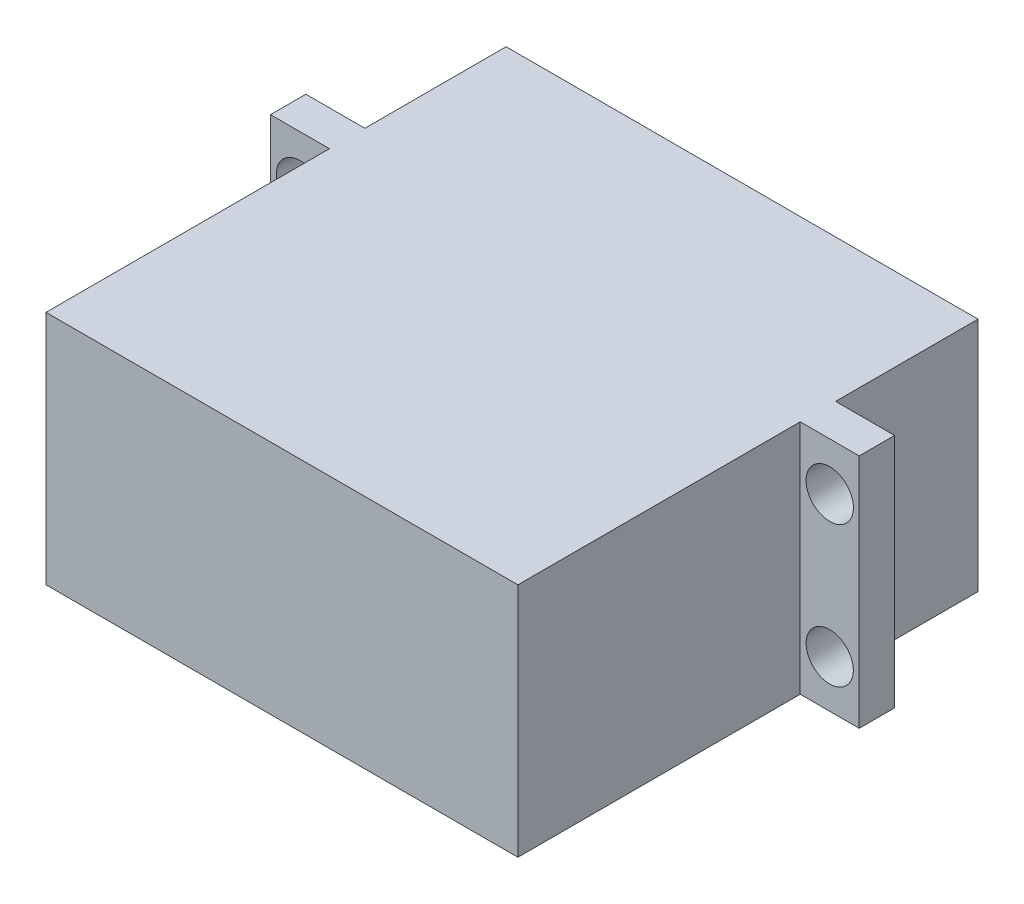
ISO-10303-21;
HEADER;
FILE_DESCRIPTION(('STEP AP214'),'2;1');
FILE_NAME('part.step','',(''),(''),'','','');
FILE_SCHEMA(('AUTOMOTIVE_DESIGN { 1 0 10303 214 1 1 1 1 }'));
ENDSEC;
DATA;
#1=APPLICATION_CONTEXT('core data for automotive mechanical design processes');
#2=APPLICATION_PROTOCOL_DEFINITION('international standard','automotive_design',2000,#1);
#3=PRODUCT_CONTEXT('',#1,'mechanical');
#4=PRODUCT('Part','Part','',(#3));
#5=PRODUCT_RELATED_PRODUCT_CATEGORY('part','',(#4));
#6=PRODUCT_DEFINITION_FORMATION('','',#4);
#7=PRODUCT_DEFINITION_CONTEXT('part definition',#1,'design');
#8=PRODUCT_DEFINITION('design','',#6,#7);
#9=PRODUCT_DEFINITION_SHAPE('','',#8);
#10=(LENGTH_UNIT() NAMED_UNIT(*) SI_UNIT(.MILLI.,.METRE.));
#11=(NAMED_UNIT(*) PLANE_ANGLE_UNIT() SI_UNIT($,.RADIAN.));
#12=(NAMED_UNIT(*) SI_UNIT($,.STERADIAN.) SOLID_ANGLE_UNIT());
#13=UNCERTAINTY_MEASURE_WITH_UNIT(LENGTH_MEASURE(1.E-05),#10,'distance_accuracy_value','');
#14=(GEOMETRIC_REPRESENTATION_CONTEXT(3) GLOBAL_UNCERTAINTY_ASSIGNED_CONTEXT((#13)) GLOBAL_UNIT_ASSIGNED_CONTEXT((#10,
#11,#12)) REPRESENTATION_CONTEXT('',''));
#15=CARTESIAN_POINT('',(0.,0.,0.));
#16=DIRECTION('',(0.,0.,1.));
#17=DIRECTION('',(1.,0.,0.));
#18=AXIS2_PLACEMENT_3D('',#15,#16,#17);
#19=CARTESIAN_POINT('',(-73.7935989473277,13.2536326018809,39.));
#20=DIRECTION('',(1.,0.,0.));
#21=DIRECTION('',(0.,0.,-1.));
#22=AXIS2_PLACEMENT_3D('',#19,#20,#21);
#23=PLANE('',#22);
#24=DIRECTION('',(0.,-1.,0.));
#25=VECTOR('',#24,1.);
#26=CARTESIAN_POINT('',(-73.7935989473277,13.2536326018809,11.9736602465696));
#27=LINE('',#26,#25);
#28=CARTESIAN_POINT('',(-73.7935989473277,13.2536326018809,11.9736602465696));
#29=VERTEX_POINT('',#28);
#30=CARTESIAN_POINT('',(-73.7935989473277,-6.74636739811911,11.9736602465696));
#31=VERTEX_POINT('',#30);
#32=EDGE_CURVE('E206',#29,#31,#27,.T.);
#33=ORIENTED_EDGE('',*,*,#32,.F.);
#34=DIRECTION('',(0.,0.,-1.));
#35=VECTOR('',#34,1.);
#36=CARTESIAN_POINT('',(-73.7935989473277,13.2536326018809,39.));
#37=LINE('',#36,#35);
#38=CARTESIAN_POINT('',(-73.7935989473277,13.2536326018809,0.));
#39=VERTEX_POINT('',#38);
#40=EDGE_CURVE('E282',#29,#39,#37,.T.);
#41=ORIENTED_EDGE('',*,*,#40,.T.);
#42=DIRECTION('',(0.,-1.,0.));
#43=VECTOR('',#42,1.);
#44=CARTESIAN_POINT('',(-73.7935989473277,13.2536326018809,0.));
#45=LINE('',#44,#43);
#46=CARTESIAN_POINT('',(-73.7935989473277,-6.74636739811911,0.));
#47=VERTEX_POINT('',#46);
#48=EDGE_CURVE('E267',#39,#47,#45,.T.);
#49=ORIENTED_EDGE('',*,*,#48,.T.);
#50=DIRECTION('',(0.,0.,-1.));
#51=VECTOR('',#50,1.);
#52=CARTESIAN_POINT('',(-73.7935989473277,-6.74636739811911,39.));
#53=LINE('',#52,#51);
#54=EDGE_CURVE('E310',#31,#47,#53,.T.);
#55=ORIENTED_EDGE('',*,*,#54,.F.);
#56=EDGE_LOOP('',(#33,#41,#49,#55));
#57=FACE_BOUND('',#56,.T.);
#58=ADVANCED_FACE('F45',(#57),#23,.F.);
#59=CARTESIAN_POINT('',(-33.7935989473277,13.2536326018809,39.));
#60=DIRECTION('',(-1.,0.,0.));
#61=DIRECTION('',(0.,0.,1.));
#62=AXIS2_PLACEMENT_3D('',#59,#60,#61);
#63=PLANE('',#62);
#64=DIRECTION('',(0.,-1.,0.));
#65=VECTOR('',#64,1.);
#66=CARTESIAN_POINT('',(-33.7935989473277,13.2536326018809,15.0683879622235));
#67=LINE('',#66,#65);
#68=CARTESIAN_POINT('',(-33.7935989473277,13.2536326018809,15.0683879622235));
#69=VERTEX_POINT('',#68);
#70=CARTESIAN_POINT('',(-33.7935989473277,-6.74636739811911,15.0683879622235));
#71=VERTEX_POINT('',#70);
#72=EDGE_CURVE('E232',#69,#71,#67,.T.);
#73=ORIENTED_EDGE('',*,*,#72,.F.);
#74=DIRECTION('',(0.,0.,-1.));
#75=VECTOR('',#74,1.);
#76=CARTESIAN_POINT('',(-33.7935989473277,13.2536326018809,39.));
#77=LINE('',#76,#75);
#78=CARTESIAN_POINT('',(-33.7935989473277,13.2536326018809,39.));
#79=VERTEX_POINT('',#78);
#80=EDGE_CURVE('E302',#79,#69,#77,.T.);
#81=ORIENTED_EDGE('',*,*,#80,.F.);
#82=DIRECTION('',(0.,1.,0.));
#83=VECTOR('',#82,1.);
#84=CARTESIAN_POINT('',(-33.7935989473277,13.2536326018809,39.));
#85=LINE('',#84,#83);
#86=CARTESIAN_POINT('',(-33.7935989473277,-6.74636739811911,39.));
#87=VERTEX_POINT('',#86);
#88=EDGE_CURVE('E276',#87,#79,#85,.T.);
#89=ORIENTED_EDGE('',*,*,#88,.F.);
#90=DIRECTION('',(0.,0.,-1.));
#91=VECTOR('',#90,1.);
#92=CARTESIAN_POINT('',(-33.7935989473277,-6.74636739811911,39.));
#93=LINE('',#92,#91);
#94=EDGE_CURVE('E307',#87,#71,#93,.T.);
#95=ORIENTED_EDGE('',*,*,#94,.T.);
#96=EDGE_LOOP('',(#73,#81,#89,#95));
#97=FACE_BOUND('',#96,.T.);
#98=ADVANCED_FACE('F383',(#97),#63,.F.);
#99=DIRECTION('',(0.,1.,0.));
#100=VECTOR('',#99,1.);
#101=CARTESIAN_POINT('',(-33.7935989473277,13.2536326018809,12.0683879622235));
#102=LINE('',#101,#100);
#103=CARTESIAN_POINT('',(-33.7935989473277,-6.74636739811911,12.0683879622235));
#104=VERTEX_POINT('',#103);
#105=CARTESIAN_POINT('',(-33.7935989473277,13.2536326018809,12.0683879622235));
#106=VERTEX_POINT('',#105);
#107=EDGE_CURVE('E69',#104,#106,#102,.T.);
#108=ORIENTED_EDGE('',*,*,#107,.F.);
#109=CARTESIAN_POINT('',(-33.7935989473277,-6.74636739811911,0.));
#110=VERTEX_POINT('',#109);
#111=EDGE_CURVE('E306',#104,#110,#93,.T.);
#112=ORIENTED_EDGE('',*,*,#111,.T.);
#113=DIRECTION('',(0.,1.,0.));
#114=VECTOR('',#113,1.);
#115=CARTESIAN_POINT('',(-33.7935989473277,13.2536326018809,0.));
#116=LINE('',#115,#114);
#117=CARTESIAN_POINT('',(-33.7935989473277,13.2536326018809,0.));
#118=VERTEX_POINT('',#117);
#119=EDGE_CURVE('E290',#110,#118,#116,.T.);
#120=ORIENTED_EDGE('',*,*,#119,.T.);
#121=EDGE_CURVE('E301',#106,#118,#77,.T.);
#122=ORIENTED_EDGE('',*,*,#121,.F.);
#123=EDGE_LOOP('',(#108,#112,#120,#122));
#124=FACE_BOUND('',#123,.T.);
#125=ADVANCED_FACE('F356',(#124),#63,.F.);
#126=CARTESIAN_POINT('',(-73.7935989473277,13.2536326018809,39.));
#127=VERTEX_POINT('',#126);
#128=CARTESIAN_POINT('',(-73.7935989473277,13.2536326018809,14.9736602465696));
#129=VERTEX_POINT('',#128);
#130=EDGE_CURVE('E297',#127,#129,#37,.T.);
#131=ORIENTED_EDGE('',*,*,#130,.T.);
#132=DIRECTION('',(0.,-1.,0.));
#133=VECTOR('',#132,1.);
#134=CARTESIAN_POINT('',(-73.7935989473277,13.2536326018809,14.9736602465696));
#135=LINE('',#134,#133);
#136=CARTESIAN_POINT('',(-73.7935989473277,-6.74636739811911,14.9736602465696));
#137=VERTEX_POINT('',#136);
#138=EDGE_CURVE('E190',#129,#137,#135,.T.);
#139=ORIENTED_EDGE('',*,*,#138,.T.);
#140=CARTESIAN_POINT('',(-73.7935989473277,-6.74636739811911,39.));
#141=VERTEX_POINT('',#140);
#142=EDGE_CURVE('E54',#141,#137,#53,.T.);
#143=ORIENTED_EDGE('',*,*,#142,.F.);
#144=DIRECTION('',(0.,-1.,0.));
#145=VECTOR('',#144,1.);
#146=CARTESIAN_POINT('',(-73.7935989473277,13.2536326018809,39.));
#147=LINE('',#146,#145);
#148=EDGE_CURVE('E268',#127,#141,#147,.T.);
#149=ORIENTED_EDGE('',*,*,#148,.F.);
#150=EDGE_LOOP('',(#131,#139,#143,#149));
#151=FACE_BOUND('',#150,.T.);
#152=ADVANCED_FACE('F47',(#151),#23,.F.);
#153=CARTESIAN_POINT('',(-73.7935989473277,-6.74636739811911,39.));
#154=DIRECTION('',(0.,1.,0.));
#155=DIRECTION('',(0.,0.,1.));
#156=AXIS2_PLACEMENT_3D('',#153,#154,#155);
#157=PLANE('',#156);
#158=DIRECTION('',(1.,0.,0.));
#159=VECTOR('',#158,1.);
#160=CARTESIAN_POINT('',(-73.7935989473277,-6.74636739811911,0.));
#161=LINE('',#160,#159);
#162=EDGE_CURVE('E286',#47,#110,#161,.T.);
#163=ORIENTED_EDGE('',*,*,#162,.T.);
#164=ORIENTED_EDGE('',*,*,#111,.F.);
#165=DIRECTION('',(-1.,0.,0.));
#166=VECTOR('',#165,1.);
#167=CARTESIAN_POINT('',(-28.7935989473277,-6.74636739811911,12.0683879622235));
#168=LINE('',#167,#166);
#169=CARTESIAN_POINT('',(-28.7935989473277,-6.74636739811911,12.0683879622235));
#170=VERTEX_POINT('',#169);
#171=EDGE_CURVE('E259',#170,#104,#168,.T.);
#172=ORIENTED_EDGE('',*,*,#171,.F.);
#173=DIRECTION('',(0.,0.,-1.));
#174=VECTOR('',#173,1.);
#175=CARTESIAN_POINT('',(-28.7935989473277,-6.74636739811911,15.0683879622235));
#176=LINE('',#175,#174);
#177=CARTESIAN_POINT('',(-28.7935989473277,-6.74636739811911,15.0683879622235));
#178=VERTEX_POINT('',#177);
#179=EDGE_CURVE('E237',#178,#170,#176,.T.);
#180=ORIENTED_EDGE('',*,*,#179,.F.);
#181=DIRECTION('',(-1.,0.,0.));
#182=VECTOR('',#181,1.);
#183=CARTESIAN_POINT('',(-28.7935989473277,-6.74636739811911,15.0683879622235));
#184=LINE('',#183,#182);
#185=EDGE_CURVE('E263',#178,#71,#184,.T.);
#186=ORIENTED_EDGE('',*,*,#185,.T.);
#187=ORIENTED_EDGE('',*,*,#94,.F.);
#188=DIRECTION('',(1.,0.,0.));
#189=VECTOR('',#188,1.);
#190=CARTESIAN_POINT('',(-73.7935989473277,-6.74636739811911,39.));
#191=LINE('',#190,#189);
#192=EDGE_CURVE('E272',#141,#87,#191,.T.);
#193=ORIENTED_EDGE('',*,*,#192,.F.);
#194=ORIENTED_EDGE('',*,*,#142,.T.);
#195=DIRECTION('',(1.,0.,0.));
#196=VECTOR('',#195,1.);
#197=CARTESIAN_POINT('',(-78.7935989473277,-6.74636739811911,14.9736602465696));
#198=LINE('',#197,#196);
#199=CARTESIAN_POINT('',(-78.7935989473277,-6.74636739811911,14.9736602465696));
#200=VERTEX_POINT('',#199);
#201=EDGE_CURVE('E61',#200,#137,#198,.T.);
#202=ORIENTED_EDGE('',*,*,#201,.F.);
#203=DIRECTION('',(0.,0.,1.));
#204=VECTOR('',#203,1.);
#205=CARTESIAN_POINT('',(-78.7935989473277,-6.74636739811911,11.9736602465696));
#206=LINE('',#205,#204);
#207=CARTESIAN_POINT('',(-78.7935989473277,-6.74636739811911,11.9736602465696));
#208=VERTEX_POINT('',#207);
#209=EDGE_CURVE('E202',#208,#200,#206,.T.);
#210=ORIENTED_EDGE('',*,*,#209,.F.);
#211=DIRECTION('',(1.,0.,0.));
#212=VECTOR('',#211,1.);
#213=CARTESIAN_POINT('',(-78.7935989473277,-6.74636739811911,11.9736602465696));
#214=LINE('',#213,#212);
#215=EDGE_CURVE('E216',#208,#31,#214,.T.);
#216=ORIENTED_EDGE('',*,*,#215,.T.);
#217=ORIENTED_EDGE('',*,*,#54,.T.);
#218=EDGE_LOOP('',(#163,#164,#172,#180,#186,#187,#193,#194,#202,#210,#216,#217));
#219=FACE_BOUND('',#218,.T.);
#220=ADVANCED_FACE('F360',(#219),#157,.F.);
#221=CARTESIAN_POINT('',(-73.7935989473277,13.2536326018809,39.));
#222=DIRECTION('',(0.,-1.,0.));
#223=DIRECTION('',(0.,0.,-1.));
#224=AXIS2_PLACEMENT_3D('',#221,#222,#223);
#225=PLANE('',#224);
#226=DIRECTION('',(-1.,0.,0.));
#227=VECTOR('',#226,1.);
#228=CARTESIAN_POINT('',(-73.7935989473277,13.2536326018809,0.));
#229=LINE('',#228,#227);
#230=EDGE_CURVE('E273',#118,#39,#229,.T.);
#231=ORIENTED_EDGE('',*,*,#230,.T.);
#232=ORIENTED_EDGE('',*,*,#40,.F.);
#233=DIRECTION('',(1.,0.,0.));
#234=VECTOR('',#233,1.);
#235=CARTESIAN_POINT('',(-78.7935989473277,13.2536326018809,11.9736602465696));
#236=LINE('',#235,#234);
#237=CARTESIAN_POINT('',(-78.7935989473277,13.2536326018809,11.9736602465696));
#238=VERTEX_POINT('',#237);
#239=EDGE_CURVE('E224',#238,#29,#236,.T.);
#240=ORIENTED_EDGE('',*,*,#239,.F.);
#241=DIRECTION('',(0.,0.,1.));
#242=VECTOR('',#241,1.);
#243=CARTESIAN_POINT('',(-78.7935989473277,13.2536326018809,11.9736602465696));
#244=LINE('',#243,#242);
#245=CARTESIAN_POINT('',(-78.7935989473277,13.2536326018809,14.9736602465696));
#246=VERTEX_POINT('',#245);
#247=EDGE_CURVE('E209',#238,#246,#244,.T.);
#248=ORIENTED_EDGE('',*,*,#247,.T.);
#249=DIRECTION('',(1.,0.,0.));
#250=VECTOR('',#249,1.);
#251=CARTESIAN_POINT('',(-78.7935989473277,13.2536326018809,14.9736602465696));
#252=LINE('',#251,#250);
#253=EDGE_CURVE('E227',#246,#129,#252,.T.);
#254=ORIENTED_EDGE('',*,*,#253,.T.);
#255=ORIENTED_EDGE('',*,*,#130,.F.);
#256=DIRECTION('',(-1.,0.,0.));
#257=VECTOR('',#256,1.);
#258=CARTESIAN_POINT('',(-73.7935989473277,13.2536326018809,39.));
#259=LINE('',#258,#257);
#260=EDGE_CURVE('E279',#79,#127,#259,.T.);
#261=ORIENTED_EDGE('',*,*,#260,.F.);
#262=ORIENTED_EDGE('',*,*,#80,.T.);
#263=DIRECTION('',(-1.,0.,0.));
#264=VECTOR('',#263,1.);
#265=CARTESIAN_POINT('',(-28.7935989473277,13.2536326018809,15.0683879622235));
#266=LINE('',#265,#264);
#267=CARTESIAN_POINT('',(-28.7935989473277,13.2536326018809,15.0683879622235));
#268=VERTEX_POINT('',#267);
#269=EDGE_CURVE('E246',#268,#69,#266,.T.);
#270=ORIENTED_EDGE('',*,*,#269,.F.);
#271=DIRECTION('',(0.,0.,1.));
#272=VECTOR('',#271,1.);
#273=CARTESIAN_POINT('',(-28.7935989473277,13.2536326018809,15.0683879622235));
#274=LINE('',#273,#272);
#275=CARTESIAN_POINT('',(-28.7935989473277,13.2536326018809,12.0683879622235));
#276=VERTEX_POINT('',#275);
#277=EDGE_CURVE('E243',#276,#268,#274,.T.);
#278=ORIENTED_EDGE('',*,*,#277,.F.);
#279=DIRECTION('',(-1.,0.,0.));
#280=VECTOR('',#279,1.);
#281=CARTESIAN_POINT('',(-28.7935989473277,13.2536326018809,12.0683879622235));
#282=LINE('',#281,#280);
#283=EDGE_CURVE('E255',#276,#106,#282,.T.);
#284=ORIENTED_EDGE('',*,*,#283,.T.);
#285=ORIENTED_EDGE('',*,*,#121,.T.);
#286=EDGE_LOOP('',(#231,#232,#240,#248,#254,#255,#261,#262,#270,#278,#284,#285));
#287=FACE_BOUND('',#286,.T.);
#288=ADVANCED_FACE('F352',(#287),#225,.F.);
#289=CARTESIAN_POINT('',(0.,0.,39.));
#290=DIRECTION('',(0.,0.,1.));
#291=DIRECTION('',(1.,0.,0.));
#292=AXIS2_PLACEMENT_3D('',#289,#290,#291);
#293=PLANE('',#292);
#294=ORIENTED_EDGE('',*,*,#148,.T.);
#295=ORIENTED_EDGE('',*,*,#192,.T.);
#296=ORIENTED_EDGE('',*,*,#88,.T.);
#297=ORIENTED_EDGE('',*,*,#260,.T.);
#298=EDGE_LOOP('',(#294,#295,#296,#297));
#299=FACE_BOUND('',#298,.T.);
#300=ADVANCED_FACE('F340',(#299),#293,.T.);
#301=CARTESIAN_POINT('',(0.,0.,0.));
#302=DIRECTION('',(0.,0.,1.));
#303=DIRECTION('',(1.,0.,0.));
#304=AXIS2_PLACEMENT_3D('',#301,#302,#303);
#305=PLANE('',#304);
#306=CARTESIAN_POINT('',(-43.2939368986119,3.25363260188089,0.));
#307=DIRECTION('',(0.,0.,1.));
#308=DIRECTION('',(1.,0.,0.));
#309=AXIS2_PLACEMENT_3D('',#306,#307,#308);
#310=CIRCLE('',#309,7.);
#311=CARTESIAN_POINT('',(-36.2939368986119,3.25363260188089,0.));
#312=VERTEX_POINT('',#311);
#313=EDGE_CURVE('E11',#312,#312,#310,.F.);
#314=ORIENTED_EDGE('',*,*,#313,.F.);
#315=EDGE_LOOP('',(#314));
#316=FACE_BOUND('',#315,.T.);
#317=ORIENTED_EDGE('',*,*,#48,.F.);
#318=ORIENTED_EDGE('',*,*,#230,.F.);
#319=ORIENTED_EDGE('',*,*,#119,.F.);
#320=ORIENTED_EDGE('',*,*,#162,.F.);
#321=EDGE_LOOP('',(#317,#318,#319,#320));
#322=FACE_BOUND('',#321,.T.);
#323=ADVANCED_FACE('F336',(#316,#322),#305,.F.);
#324=CARTESIAN_POINT('',(-28.7935989473277,13.2536326018809,15.0683879622235));
#325=DIRECTION('',(0.,0.,-1.));
#326=DIRECTION('',(-1.,0.,0.));
#327=AXIS2_PLACEMENT_3D('',#324,#325,#326);
#328=PLANE('',#327);
#329=CARTESIAN_POINT('',(-31.2935989473277,9.1990248345134,15.0683879622235));
#330=DIRECTION('',(0.,0.,-1.));
#331=DIRECTION('',(0.,1.,0.));
#332=AXIS2_PLACEMENT_3D('',#329,#330,#331);
#333=CIRCLE('',#332,2.00907110237224);
#334=CARTESIAN_POINT('',(-31.2935989473277,11.2080959368856,15.0683879622235));
#335=VERTEX_POINT('',#334);
#336=EDGE_CURVE('E170',#335,#335,#333,.T.);
#337=ORIENTED_EDGE('',*,*,#336,.T.);
#338=EDGE_LOOP('',(#337));
#339=FACE_BOUND('',#338,.T.);
#340=CARTESIAN_POINT('',(-31.2935989473277,-2.74636739811911,15.0683879622235));
#341=DIRECTION('',(0.,0.,-1.));
#342=DIRECTION('',(0.,1.,0.));
#343=AXIS2_PLACEMENT_3D('',#340,#341,#342);
#344=CIRCLE('',#343,2.);
#345=CARTESIAN_POINT('',(-31.2935989473277,-0.74636739811911,15.0683879622235));
#346=VERTEX_POINT('',#345);
#347=EDGE_CURVE('E169',#346,#346,#344,.T.);
#348=ORIENTED_EDGE('',*,*,#347,.T.);
#349=EDGE_LOOP('',(#348));
#350=FACE_BOUND('',#349,.T.);
#351=ORIENTED_EDGE('',*,*,#72,.T.);
#352=ORIENTED_EDGE('',*,*,#185,.F.);
#353=DIRECTION('',(0.,-1.,0.));
#354=VECTOR('',#353,1.);
#355=CARTESIAN_POINT('',(-28.7935989473277,13.2536326018809,15.0683879622235));
#356=LINE('',#355,#354);
#357=EDGE_CURVE('E233',#268,#178,#356,.T.);
#358=ORIENTED_EDGE('',*,*,#357,.F.);
#359=ORIENTED_EDGE('',*,*,#269,.T.);
#360=EDGE_LOOP('',(#351,#352,#358,#359));
#361=FACE_BOUND('',#360,.T.);
#362=ADVANCED_FACE('F339',(#339,#350,#361),#328,.F.);
#363=CARTESIAN_POINT('',(-28.7935989473277,13.2536326018809,12.0683879622235));
#364=DIRECTION('',(0.,0.,1.));
#365=DIRECTION('',(0.,-1.,0.));
#366=AXIS2_PLACEMENT_3D('',#363,#364,#365);
#367=PLANE('',#366);
#368=CARTESIAN_POINT('',(-31.2935989473277,9.1990248345134,12.0683879622235));
#369=DIRECTION('',(0.,0.,-1.));
#370=DIRECTION('',(0.,1.,0.));
#371=AXIS2_PLACEMENT_3D('',#368,#369,#370);
#372=CIRCLE('',#371,2.00907110237224);
#373=CARTESIAN_POINT('',(-31.2935989473277,11.2080959368856,12.0683879622235));
#374=VERTEX_POINT('',#373);
#375=EDGE_CURVE('E175',#374,#374,#372,.T.);
#376=ORIENTED_EDGE('',*,*,#375,.F.);
#377=EDGE_LOOP('',(#376));
#378=FACE_BOUND('',#377,.T.);
#379=CARTESIAN_POINT('',(-31.2935989473277,-2.74636739811911,12.0683879622235));
#380=DIRECTION('',(0.,0.,-1.));
#381=DIRECTION('',(0.,1.,0.));
#382=AXIS2_PLACEMENT_3D('',#379,#380,#381);
#383=CIRCLE('',#382,2.);
#384=CARTESIAN_POINT('',(-31.2935989473277,-0.746367398119109,12.0683879622235));
#385=VERTEX_POINT('',#384);
#386=EDGE_CURVE('E179',#385,#385,#383,.T.);
#387=ORIENTED_EDGE('',*,*,#386,.F.);
#388=EDGE_LOOP('',(#387));
#389=FACE_BOUND('',#388,.T.);
#390=ORIENTED_EDGE('',*,*,#107,.T.);
#391=ORIENTED_EDGE('',*,*,#283,.F.);
#392=DIRECTION('',(0.,1.,0.));
#393=VECTOR('',#392,1.);
#394=CARTESIAN_POINT('',(-28.7935989473277,13.2536326018809,12.0683879622235));
#395=LINE('',#394,#393);
#396=EDGE_CURVE('E240',#170,#276,#395,.T.);
#397=ORIENTED_EDGE('',*,*,#396,.F.);
#398=ORIENTED_EDGE('',*,*,#171,.T.);
#399=EDGE_LOOP('',(#390,#391,#397,#398));
#400=FACE_BOUND('',#399,.T.);
#401=ADVANCED_FACE('F391',(#378,#389,#400),#367,.F.);
#402=CARTESIAN_POINT('',(-28.7935989473277,0.,0.));
#403=DIRECTION('',(1.,0.,0.));
#404=DIRECTION('',(0.,0.,-1.));
#405=AXIS2_PLACEMENT_3D('',#402,#403,#404);
#406=PLANE('',#405);
#407=ORIENTED_EDGE('',*,*,#357,.T.);
#408=ORIENTED_EDGE('',*,*,#179,.T.);
#409=ORIENTED_EDGE('',*,*,#396,.T.);
#410=ORIENTED_EDGE('',*,*,#277,.T.);
#411=EDGE_LOOP('',(#407,#408,#409,#410));
#412=FACE_BOUND('',#411,.T.);
#413=ADVANCED_FACE('F388',(#412),#406,.T.);
#414=CARTESIAN_POINT('',(-78.7935989473277,13.2536326018809,14.9736602465696));
#415=DIRECTION('',(0.,0.,1.));
#416=DIRECTION('',(0.,-1.,0.));
#417=AXIS2_PLACEMENT_3D('',#414,#415,#416);
#418=PLANE('',#417);
#419=CARTESIAN_POINT('',(-76.2935989473277,9.14205669696298,14.9736602465696));
#420=DIRECTION('',(0.,0.,-1.));
#421=DIRECTION('',(0.,1.,0.));
#422=AXIS2_PLACEMENT_3D('',#419,#420,#421);
#423=CIRCLE('',#422,2.);
#424=CARTESIAN_POINT('',(-76.2935989473277,11.142056696963,14.9736602465696));
#425=VERTEX_POINT('',#424);
#426=EDGE_CURVE('E186',#425,#425,#423,.T.);
#427=ORIENTED_EDGE('',*,*,#426,.T.);
#428=EDGE_LOOP('',(#427));
#429=FACE_BOUND('',#428,.T.);
#430=CARTESIAN_POINT('',(-76.2935989473277,-3.,14.9736602465696));
#431=DIRECTION('',(0.,0.,-1.));
#432=DIRECTION('',(0.,1.,0.));
#433=AXIS2_PLACEMENT_3D('',#430,#431,#432);
#434=CIRCLE('',#433,2.);
#435=CARTESIAN_POINT('',(-76.2935989473277,-1.,14.9736602465696));
#436=VERTEX_POINT('',#435);
#437=EDGE_CURVE('E174',#436,#436,#434,.T.);
#438=ORIENTED_EDGE('',*,*,#437,.T.);
#439=EDGE_LOOP('',(#438));
#440=FACE_BOUND('',#439,.T.);
#441=ORIENTED_EDGE('',*,*,#138,.F.);
#442=ORIENTED_EDGE('',*,*,#253,.F.);
#443=DIRECTION('',(0.,-1.,0.));
#444=VECTOR('',#443,1.);
#445=CARTESIAN_POINT('',(-78.7935989473277,13.2536326018809,14.9736602465696));
#446=LINE('',#445,#444);
#447=EDGE_CURVE('E205',#246,#200,#446,.T.);
#448=ORIENTED_EDGE('',*,*,#447,.T.);
#449=ORIENTED_EDGE('',*,*,#201,.T.);
#450=EDGE_LOOP('',(#441,#442,#448,#449));
#451=FACE_BOUND('',#450,.T.);
#452=ADVANCED_FACE('F372',(#429,#440,#451),#418,.T.);
#453=CARTESIAN_POINT('',(-78.7935989473277,13.2536326018809,11.9736602465696));
#454=DIRECTION('',(0.,0.,1.));
#455=DIRECTION('',(0.,-1.,0.));
#456=AXIS2_PLACEMENT_3D('',#453,#454,#455);
#457=PLANE('',#456);
#458=CARTESIAN_POINT('',(-76.2935989473277,9.14205669696298,11.9736602465696));
#459=DIRECTION('',(0.,0.,-1.));
#460=DIRECTION('',(0.,1.,0.));
#461=AXIS2_PLACEMENT_3D('',#458,#459,#460);
#462=CIRCLE('',#461,2.);
#463=CARTESIAN_POINT('',(-76.2935989473277,11.142056696963,11.9736602465696));
#464=VERTEX_POINT('',#463);
#465=EDGE_CURVE('E191',#464,#464,#462,.T.);
#466=ORIENTED_EDGE('',*,*,#465,.F.);
#467=EDGE_LOOP('',(#466));
#468=FACE_BOUND('',#467,.T.);
#469=CARTESIAN_POINT('',(-76.2935989473277,-3.,11.9736602465696));
#470=DIRECTION('',(0.,0.,-1.));
#471=DIRECTION('',(0.,1.,0.));
#472=AXIS2_PLACEMENT_3D('',#469,#470,#471);
#473=CIRCLE('',#472,2.);
#474=CARTESIAN_POINT('',(-76.2935989473277,-1.,11.9736602465696));
#475=VERTEX_POINT('',#474);
#476=EDGE_CURVE('E195',#475,#475,#473,.T.);
#477=ORIENTED_EDGE('',*,*,#476,.F.);
#478=EDGE_LOOP('',(#477));
#479=FACE_BOUND('',#478,.T.);
#480=ORIENTED_EDGE('',*,*,#32,.T.);
#481=ORIENTED_EDGE('',*,*,#215,.F.);
#482=DIRECTION('',(0.,-1.,0.));
#483=VECTOR('',#482,1.);
#484=CARTESIAN_POINT('',(-78.7935989473277,13.2536326018809,11.9736602465696));
#485=LINE('',#484,#483);
#486=EDGE_CURVE('E213',#238,#208,#485,.T.);
#487=ORIENTED_EDGE('',*,*,#486,.F.);
#488=ORIENTED_EDGE('',*,*,#239,.T.);
#489=EDGE_LOOP('',(#480,#481,#487,#488));
#490=FACE_BOUND('',#489,.T.);
#491=ADVANCED_FACE('F366',(#468,#479,#490),#457,.F.);
#492=CARTESIAN_POINT('',(-78.7935989473277,0.,0.));
#493=DIRECTION('',(1.,0.,0.));
#494=DIRECTION('',(0.,0.,-1.));
#495=AXIS2_PLACEMENT_3D('',#492,#493,#494);
#496=PLANE('',#495);
#497=ORIENTED_EDGE('',*,*,#209,.T.);
#498=ORIENTED_EDGE('',*,*,#447,.F.);
#499=ORIENTED_EDGE('',*,*,#247,.F.);
#500=ORIENTED_EDGE('',*,*,#486,.T.);
#501=EDGE_LOOP('',(#497,#498,#499,#500));
#502=FACE_BOUND('',#501,.T.);
#503=ADVANCED_FACE('F371',(#502),#496,.F.);
#504=CARTESIAN_POINT('',(-76.2935989473277,-3.,14.9736602465696));
#505=DIRECTION('',(0.,0.,-1.));
#506=DIRECTION('',(0.,1.,0.));
#507=AXIS2_PLACEMENT_3D('',#504,#505,#506);
#508=CYLINDRICAL_SURFACE('',#507,2.);
#509=ORIENTED_EDGE('',*,*,#437,.F.);
#510=EDGE_LOOP('',(#509));
#511=FACE_BOUND('',#510,.T.);
#512=ORIENTED_EDGE('',*,*,#476,.T.);
#513=EDGE_LOOP('',(#512));
#514=FACE_BOUND('',#513,.T.);
#515=ADVANCED_FACE('F480',(#511,#514),#508,.F.);
#516=CARTESIAN_POINT('',(-76.2935989473277,9.14205669696298,14.9736602465696));
#517=DIRECTION('',(0.,0.,-1.));
#518=DIRECTION('',(0.,1.,0.));
#519=AXIS2_PLACEMENT_3D('',#516,#517,#518);
#520=CYLINDRICAL_SURFACE('',#519,2.);
#521=ORIENTED_EDGE('',*,*,#426,.F.);
#522=EDGE_LOOP('',(#521));
#523=FACE_BOUND('',#522,.T.);
#524=ORIENTED_EDGE('',*,*,#465,.T.);
#525=EDGE_LOOP('',(#524));
#526=FACE_BOUND('',#525,.T.);
#527=ADVANCED_FACE('F488',(#523,#526),#520,.F.);
#528=CARTESIAN_POINT('',(-31.2935989473277,-2.74636739811911,15.0683879622235));
#529=DIRECTION('',(0.,0.,-1.));
#530=DIRECTION('',(0.,1.,0.));
#531=AXIS2_PLACEMENT_3D('',#528,#529,#530);
#532=CYLINDRICAL_SURFACE('',#531,2.);
#533=ORIENTED_EDGE('',*,*,#347,.F.);
#534=EDGE_LOOP('',(#533));
#535=FACE_BOUND('',#534,.T.);
#536=ORIENTED_EDGE('',*,*,#386,.T.);
#537=EDGE_LOOP('',(#536));
#538=FACE_BOUND('',#537,.T.);
#539=ADVANCED_FACE('F497',(#535,#538),#532,.F.);
#540=CARTESIAN_POINT('',(-31.2935989473277,9.1990248345134,15.0683879622235));
#541=DIRECTION('',(0.,0.,-1.));
#542=DIRECTION('',(0.,1.,0.));
#543=AXIS2_PLACEMENT_3D('',#540,#541,#542);
#544=CYLINDRICAL_SURFACE('',#543,2.00907110237224);
#545=ORIENTED_EDGE('',*,*,#336,.F.);
#546=EDGE_LOOP('',(#545));
#547=FACE_BOUND('',#546,.T.);
#548=ORIENTED_EDGE('',*,*,#375,.T.);
#549=EDGE_LOOP('',(#548));
#550=FACE_BOUND('',#549,.T.);
#551=ADVANCED_FACE('F332',(#547,#550),#544,.F.);
#552=CARTESIAN_POINT('',(-43.2939368986119,3.25363260188089,-1.));
#553=DIRECTION('',(0.,0.,1.));
#554=DIRECTION('',(1.,0.,0.));
#555=AXIS2_PLACEMENT_3D('',#552,#553,#554);
#556=CYLINDRICAL_SURFACE('',#555,7.);
#557=CARTESIAN_POINT('',(-43.2939368986119,3.25363260188089,-1.));
#558=DIRECTION('',(0.,0.,-1.));
#559=DIRECTION('',(-1.,0.,0.));
#560=AXIS2_PLACEMENT_3D('',#557,#558,#559);
#561=CIRCLE('',#560,7.);
#562=CARTESIAN_POINT('',(-50.2939368986119,3.25363260188089,-1.));
#563=VERTEX_POINT('',#562);
#564=EDGE_CURVE('E149',#563,#563,#561,.T.);
#565=ORIENTED_EDGE('',*,*,#564,.F.);
#566=EDGE_LOOP('',(#565));
#567=FACE_BOUND('',#566,.T.);
#568=ORIENTED_EDGE('',*,*,#313,.T.);
#569=EDGE_LOOP('',(#568));
#570=FACE_BOUND('',#569,.T.);
#571=ADVANCED_FACE('F326',(#567,#570),#556,.T.);
#572=CARTESIAN_POINT('',(-43.2939368986119,3.25363260188089,-1.));
#573=DIRECTION('',(0.,0.,-1.));
#574=DIRECTION('',(-1.,0.,0.));
#575=AXIS2_PLACEMENT_3D('',#572,#573,#574);
#576=PLANE('',#575);
#577=CARTESIAN_POINT('',(-43.2939368986119,3.25363260188089,-1.));
#578=DIRECTION('',(0.,0.,-1.));
#579=DIRECTION('',(-1.,0.,0.));
#580=AXIS2_PLACEMENT_3D('',#577,#578,#579);
#581=CIRCLE('',#580,5.99999999999999);
#582=CARTESIAN_POINT('',(-49.2939368986119,3.25363260188089,-1.));
#583=VERTEX_POINT('',#582);
#584=EDGE_CURVE('E155',#583,#583,#581,.T.);
#585=ORIENTED_EDGE('',*,*,#584,.F.);
#586=EDGE_LOOP('',(#585));
#587=FACE_BOUND('',#586,.T.);
#588=ORIENTED_EDGE('',*,*,#564,.T.);
#589=EDGE_LOOP('',(#588));
#590=FACE_BOUND('',#589,.T.);
#591=ADVANCED_FACE('F322',(#587,#590),#576,.T.);
#592=CARTESIAN_POINT('',(-43.2939368986119,3.25363260188089,-6.));
#593=DIRECTION('',(0.,0.,-1.));
#594=DIRECTION('',(-1.,0.,0.));
#595=AXIS2_PLACEMENT_3D('',#592,#593,#594);
#596=PLANE('',#595);
#597=CARTESIAN_POINT('',(-43.2939368986119,3.25363260188089,-6.));
#598=DIRECTION('',(0.,0.,-1.));
#599=DIRECTION('',(-1.,0.,0.));
#600=AXIS2_PLACEMENT_3D('',#597,#598,#599);
#601=CIRCLE('',#600,0.99694999999999);
#602=CARTESIAN_POINT('',(-44.2908868986119,3.25363260188089,-6.));
#603=VERTEX_POINT('',#602);
#604=EDGE_CURVE('E150',#603,#603,#601,.T.);
#605=ORIENTED_EDGE('',*,*,#604,.F.);
#606=EDGE_LOOP('',(#605));
#607=FACE_BOUND('',#606,.T.);
#608=CARTESIAN_POINT('',(-43.2939368986119,3.25363260188089,-6.));
#609=DIRECTION('',(0.,0.,-1.));
#610=DIRECTION('',(-1.,0.,0.));
#611=AXIS2_PLACEMENT_3D('',#608,#609,#610);
#612=CIRCLE('',#611,3.);
#613=CARTESIAN_POINT('',(-46.2939368986119,3.25363260188089,-6.));
#614=VERTEX_POINT('',#613);
#615=EDGE_CURVE('E165',#614,#614,#612,.T.);
#616=ORIENTED_EDGE('',*,*,#615,.T.);
#617=EDGE_LOOP('',(#616));
#618=FACE_BOUND('',#617,.T.);
#619=ADVANCED_FACE('F325',(#607,#618),#596,.T.);
#620=CARTESIAN_POINT('',(-43.2939368986119,3.25363260188089,-6.));
#621=DIRECTION('',(0.,0.,1.));
#622=DIRECTION('',(1.,0.,0.));
#623=AXIS2_PLACEMENT_3D('',#620,#621,#622);
#624=CYLINDRICAL_SURFACE('',#623,3.);
#625=CARTESIAN_POINT('',(-43.2939368986119,3.25363260188089,-1.5));
#626=DIRECTION('',(0.,0.,-1.));
#627=DIRECTION('',(-1.,0.,0.));
#628=AXIS2_PLACEMENT_3D('',#625,#626,#627);
#629=CIRCLE('',#628,3.);
#630=CARTESIAN_POINT('',(-46.2939368986119,3.25363260188089,-1.5));
#631=VERTEX_POINT('',#630);
#632=EDGE_CURVE('E164',#631,#631,#629,.T.);
#633=ORIENTED_EDGE('',*,*,#632,.T.);
#634=EDGE_LOOP('',(#633));
#635=FACE_BOUND('',#634,.T.);
#636=ORIENTED_EDGE('',*,*,#615,.F.);
#637=EDGE_LOOP('',(#636));
#638=FACE_BOUND('',#637,.T.);
#639=ADVANCED_FACE('F518',(#635,#638),#624,.T.);
#640=CARTESIAN_POINT('',(-43.2939368986119,3.25363260188089,-1.5));
#641=DIRECTION('',(0.,0.,-1.));
#642=DIRECTION('',(-1.,0.,0.));
#643=AXIS2_PLACEMENT_3D('',#640,#641,#642);
#644=PLANE('',#643);
#645=ORIENTED_EDGE('',*,*,#632,.F.);
#646=EDGE_LOOP('',(#645));
#647=FACE_BOUND('',#646,.T.);
#648=CARTESIAN_POINT('',(-43.2939368986119,3.25363260188089,-1.5));
#649=DIRECTION('',(0.,0.,-1.));
#650=DIRECTION('',(-1.,0.,0.));
#651=AXIS2_PLACEMENT_3D('',#648,#649,#650);
#652=CIRCLE('',#651,5.99999999999999);
#653=CARTESIAN_POINT('',(-49.2939368986119,3.25363260188089,-1.5));
#654=VERTEX_POINT('',#653);
#655=EDGE_CURVE('E160',#654,#654,#652,.T.);
#656=ORIENTED_EDGE('',*,*,#655,.T.);
#657=EDGE_LOOP('',(#656));
#658=FACE_BOUND('',#657,.T.);
#659=ADVANCED_FACE('F522',(#647,#658),#644,.T.);
#660=CARTESIAN_POINT('',(-43.2939368986119,3.25363260188089,-1.5));
#661=DIRECTION('',(0.,0.,1.));
#662=DIRECTION('',(1.,0.,0.));
#663=AXIS2_PLACEMENT_3D('',#660,#661,#662);
#664=CYLINDRICAL_SURFACE('',#663,5.99999999999999);
#665=ORIENTED_EDGE('',*,*,#584,.T.);
#666=EDGE_LOOP('',(#665));
#667=FACE_BOUND('',#666,.T.);
#668=ORIENTED_EDGE('',*,*,#655,.F.);
#669=EDGE_LOOP('',(#668));
#670=FACE_BOUND('',#669,.T.);
#671=ADVANCED_FACE('F142',(#667,#670),#664,.T.);
#672=CARTESIAN_POINT('',(-43.2939368986119,3.25363260188089,-3.));
#673=DIRECTION('',(0.,0.,-1.));
#674=DIRECTION('',(-1.,0.,0.));
#675=AXIS2_PLACEMENT_3D('',#672,#673,#674);
#676=CONICAL_SURFACE('',#675,0.996949999999996,1.02974425867665);
#677=CARTESIAN_POINT('',(-43.2939368986119,3.25363260188089,-2.40097200586047));
#678=VERTEX_POINT('',#677);
#679=VERTEX_LOOP('',#678);
#680=FACE_BOUND('',#679,.T.);
#681=CARTESIAN_POINT('',(-43.2939368986119,3.25363260188089,-3.));
#682=DIRECTION('',(0.,0.,-1.));
#683=DIRECTION('',(-1.,0.,0.));
#684=AXIS2_PLACEMENT_3D('',#681,#682,#683);
#685=CIRCLE('',#684,0.996949999999996);
#686=CARTESIAN_POINT('',(-44.2908868986119,3.25363260188089,-3.));
#687=VERTEX_POINT('',#686);
#688=EDGE_CURVE('E146',#687,#687,#685,.T.);
#689=ORIENTED_EDGE('',*,*,#688,.T.);
#690=EDGE_LOOP('',(#689));
#691=FACE_BOUND('',#690,.T.);
#692=ADVANCED_FACE('F138',(#680,#691),#676,.F.);
#693=CARTESIAN_POINT('',(-43.2939368986119,3.25363260188089,-6.));
#694=DIRECTION('',(0.,0.,-1.));
#695=DIRECTION('',(-1.,0.,0.));
#696=AXIS2_PLACEMENT_3D('',#693,#694,#695);
#697=CYLINDRICAL_SURFACE('',#696,0.996949999999993);
#698=ORIENTED_EDGE('',*,*,#688,.F.);
#699=EDGE_LOOP('',(#698));
#700=FACE_BOUND('',#699,.T.);
#701=ORIENTED_EDGE('',*,*,#604,.T.);
#702=EDGE_LOOP('',(#701));
#703=FACE_BOUND('',#702,.T.);
#704=ADVANCED_FACE('F141',(#700,#703),#697,.F.);
#705=CLOSED_SHELL('',(#58,#98,#125,#152,#220,#288,#300,#323,#362,#401,#413,#452,#491,#503,#515,
#527,#539,#551,#571,#591,#619,#639,#659,#671,#692,#704));
#706=MANIFOLD_SOLID_BREP('B2',#705);
#707=ADVANCED_BREP_SHAPE_REPRESENTATION('',(#18,#706),#14);
#708=SHAPE_DEFINITION_REPRESENTATION(#9,#707);
ENDSEC;
END-ISO-10303-21;
